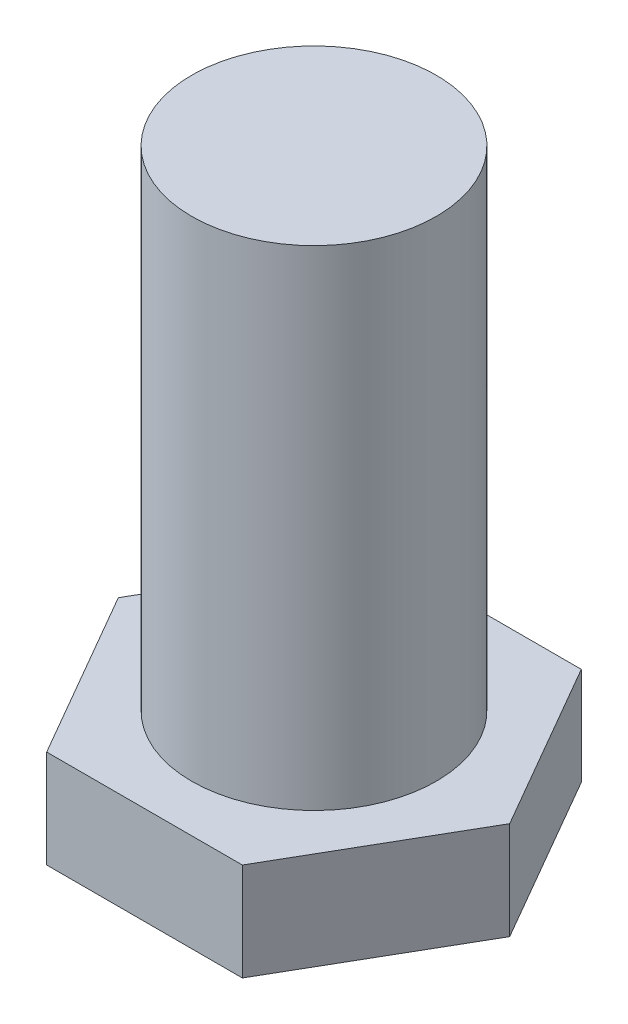
ISO-10303-21;
HEADER;
FILE_DESCRIPTION(('STEP AP214'),'2;1');
FILE_NAME('part.step','',(''),(''),'','','');
FILE_SCHEMA(('AUTOMOTIVE_DESIGN { 1 0 10303 214 1 1 1 1 }'));
ENDSEC;
DATA;
#1=APPLICATION_CONTEXT('core data for automotive mechanical design processes');
#2=APPLICATION_PROTOCOL_DEFINITION('international standard','automotive_design',2000,#1);
#3=PRODUCT_CONTEXT('',#1,'mechanical');
#4=PRODUCT('Part','Part','',(#3));
#5=PRODUCT_RELATED_PRODUCT_CATEGORY('part','',(#4));
#6=PRODUCT_DEFINITION_FORMATION('','',#4);
#7=PRODUCT_DEFINITION_CONTEXT('part definition',#1,'design');
#8=PRODUCT_DEFINITION('design','',#6,#7);
#9=PRODUCT_DEFINITION_SHAPE('','',#8);
#10=(LENGTH_UNIT() NAMED_UNIT(*) SI_UNIT(.MILLI.,.METRE.));
#11=(NAMED_UNIT(*) PLANE_ANGLE_UNIT() SI_UNIT($,.RADIAN.));
#12=(NAMED_UNIT(*) SI_UNIT($,.STERADIAN.) SOLID_ANGLE_UNIT());
#13=UNCERTAINTY_MEASURE_WITH_UNIT(LENGTH_MEASURE(1.E-05),#10,'distance_accuracy_value','');
#14=(GEOMETRIC_REPRESENTATION_CONTEXT(3) GLOBAL_UNCERTAINTY_ASSIGNED_CONTEXT((#13)) GLOBAL_UNIT_ASSIGNED_CONTEXT((#10,
#11,#12)) REPRESENTATION_CONTEXT('',''));
#15=CARTESIAN_POINT('',(0.,0.,0.));
#16=DIRECTION('',(0.,0.,1.));
#17=DIRECTION('',(1.,0.,0.));
#18=AXIS2_PLACEMENT_3D('',#15,#16,#17);
#19=CARTESIAN_POINT('',(2.,2.,3.46410161513775));
#20=DIRECTION('',(-0.866025403784439,0.,-0.499999999999999));
#21=DIRECTION('',(-0.499999999999999,0.,0.866025403784439));
#22=AXIS2_PLACEMENT_3D('',#19,#20,#21);
#23=PLANE('',#22);
#24=DIRECTION('',(0.5,0.,-0.866025403784439));
#25=VECTOR('',#24,1.);
#26=CARTESIAN_POINT('',(2.,0.,3.46410161513775));
#27=LINE('',#26,#25);
#28=CARTESIAN_POINT('',(2.,0.,3.46410161513775));
#29=VERTEX_POINT('',#28);
#30=CARTESIAN_POINT('',(4.,0.,0.));
#31=VERTEX_POINT('',#30);
#32=EDGE_CURVE('E134',#29,#31,#27,.T.);
#33=ORIENTED_EDGE('',*,*,#32,.T.);
#34=DIRECTION('',(0.,-1.,0.));
#35=VECTOR('',#34,1.);
#36=CARTESIAN_POINT('',(4.,2.,0.));
#37=LINE('',#36,#35);
#38=CARTESIAN_POINT('',(4.,2.,0.));
#39=VERTEX_POINT('',#38);
#40=EDGE_CURVE('E46',#39,#31,#37,.T.);
#41=ORIENTED_EDGE('',*,*,#40,.F.);
#42=DIRECTION('',(0.5,0.,-0.866025403784439));
#43=VECTOR('',#42,1.);
#44=CARTESIAN_POINT('',(2.,2.,3.46410161513775));
#45=LINE('',#44,#43);
#46=CARTESIAN_POINT('',(2.,2.,3.46410161513775));
#47=VERTEX_POINT('',#46);
#48=EDGE_CURVE('E151',#47,#39,#45,.T.);
#49=ORIENTED_EDGE('',*,*,#48,.F.);
#50=DIRECTION('',(0.,-1.,0.));
#51=VECTOR('',#50,1.);
#52=CARTESIAN_POINT('',(2.,2.,3.46410161513775));
#53=LINE('',#52,#51);
#54=EDGE_CURVE('E130',#47,#29,#53,.T.);
#55=ORIENTED_EDGE('',*,*,#54,.T.);
#56=EDGE_LOOP('',(#33,#41,#49,#55));
#57=FACE_BOUND('',#56,.T.);
#58=ADVANCED_FACE('F43',(#57),#23,.F.);
#59=CARTESIAN_POINT('',(4.,2.,0.));
#60=DIRECTION('',(-0.866025403784439,0.,0.5));
#61=DIRECTION('',(0.5,0.,0.866025403784439));
#62=AXIS2_PLACEMENT_3D('',#59,#60,#61);
#63=PLANE('',#62);
#64=DIRECTION('',(-0.5,0.,-0.866025403784439));
#65=VECTOR('',#64,1.);
#66=CARTESIAN_POINT('',(4.,0.,0.));
#67=LINE('',#66,#65);
#68=CARTESIAN_POINT('',(2.,0.,-3.46410161513775));
#69=VERTEX_POINT('',#68);
#70=EDGE_CURVE('E138',#31,#69,#67,.T.);
#71=ORIENTED_EDGE('',*,*,#70,.T.);
#72=DIRECTION('',(0.,-1.,0.));
#73=VECTOR('',#72,1.);
#74=CARTESIAN_POINT('',(2.,2.,-3.46410161513775));
#75=LINE('',#74,#73);
#76=CARTESIAN_POINT('',(2.,2.,-3.46410161513775));
#77=VERTEX_POINT('',#76);
#78=EDGE_CURVE('E157',#77,#69,#75,.T.);
#79=ORIENTED_EDGE('',*,*,#78,.F.);
#80=DIRECTION('',(-0.5,0.,-0.866025403784439));
#81=VECTOR('',#80,1.);
#82=CARTESIAN_POINT('',(4.,2.,0.));
#83=LINE('',#82,#81);
#84=EDGE_CURVE('E99',#39,#77,#83,.T.);
#85=ORIENTED_EDGE('',*,*,#84,.F.);
#86=ORIENTED_EDGE('',*,*,#40,.T.);
#87=EDGE_LOOP('',(#71,#79,#85,#86));
#88=FACE_BOUND('',#87,.T.);
#89=ADVANCED_FACE('F164',(#88),#63,.F.);
#90=CARTESIAN_POINT('',(2.,2.,-3.46410161513775));
#91=DIRECTION('',(0.,0.,1.));
#92=DIRECTION('',(1.,0.,0.));
#93=AXIS2_PLACEMENT_3D('',#90,#91,#92);
#94=PLANE('',#93);
#95=DIRECTION('',(-1.,0.,0.));
#96=VECTOR('',#95,1.);
#97=CARTESIAN_POINT('',(2.,0.,-3.46410161513775));
#98=LINE('',#97,#96);
#99=CARTESIAN_POINT('',(-2.,0.,-3.46410161513775));
#100=VERTEX_POINT('',#99);
#101=EDGE_CURVE('E142',#69,#100,#98,.T.);
#102=ORIENTED_EDGE('',*,*,#101,.T.);
#103=DIRECTION('',(0.,-1.,0.));
#104=VECTOR('',#103,1.);
#105=CARTESIAN_POINT('',(-2.,2.,-3.46410161513775));
#106=LINE('',#105,#104);
#107=CARTESIAN_POINT('',(-2.,2.,-3.46410161513775));
#108=VERTEX_POINT('',#107);
#109=EDGE_CURVE('E123',#108,#100,#106,.T.);
#110=ORIENTED_EDGE('',*,*,#109,.F.);
#111=DIRECTION('',(-1.,0.,0.));
#112=VECTOR('',#111,1.);
#113=CARTESIAN_POINT('',(2.,2.,-3.46410161513775));
#114=LINE('',#113,#112);
#115=EDGE_CURVE('E112',#77,#108,#114,.T.);
#116=ORIENTED_EDGE('',*,*,#115,.F.);
#117=ORIENTED_EDGE('',*,*,#78,.T.);
#118=EDGE_LOOP('',(#102,#110,#116,#117));
#119=FACE_BOUND('',#118,.T.);
#120=ADVANCED_FACE('F170',(#119),#94,.F.);
#121=CARTESIAN_POINT('',(-2.,2.,-3.46410161513775));
#122=DIRECTION('',(0.866025403784439,0.,0.5));
#123=DIRECTION('',(0.5,0.,-0.866025403784439));
#124=AXIS2_PLACEMENT_3D('',#121,#122,#123);
#125=PLANE('',#124);
#126=DIRECTION('',(-0.5,0.,0.866025403784439));
#127=VECTOR('',#126,1.);
#128=CARTESIAN_POINT('',(-2.,0.,-3.46410161513775));
#129=LINE('',#128,#127);
#130=CARTESIAN_POINT('',(-4.,0.,0.));
#131=VERTEX_POINT('',#130);
#132=EDGE_CURVE('E121',#100,#131,#129,.T.);
#133=ORIENTED_EDGE('',*,*,#132,.T.);
#134=DIRECTION('',(0.,-1.,0.));
#135=VECTOR('',#134,1.);
#136=CARTESIAN_POINT('',(-4.,2.,0.));
#137=LINE('',#136,#135);
#138=CARTESIAN_POINT('',(-4.,2.,0.));
#139=VERTEX_POINT('',#138);
#140=EDGE_CURVE('E118',#139,#131,#137,.T.);
#141=ORIENTED_EDGE('',*,*,#140,.F.);
#142=DIRECTION('',(-0.5,0.,0.866025403784439));
#143=VECTOR('',#142,1.);
#144=CARTESIAN_POINT('',(-2.,2.,-3.46410161513775));
#145=LINE('',#144,#143);
#146=EDGE_CURVE('E106',#108,#139,#145,.T.);
#147=ORIENTED_EDGE('',*,*,#146,.F.);
#148=ORIENTED_EDGE('',*,*,#109,.T.);
#149=EDGE_LOOP('',(#133,#141,#147,#148));
#150=FACE_BOUND('',#149,.T.);
#151=ADVANCED_FACE('F119',(#150),#125,.F.);
#152=CARTESIAN_POINT('',(-4.,2.,0.));
#153=DIRECTION('',(0.866025403784439,0.,-0.5));
#154=DIRECTION('',(-0.5,0.,-0.866025403784439));
#155=AXIS2_PLACEMENT_3D('',#152,#153,#154);
#156=PLANE('',#155);
#157=DIRECTION('',(0.5,0.,0.866025403784439));
#158=VECTOR('',#157,1.);
#159=CARTESIAN_POINT('',(-4.,0.,0.));
#160=LINE('',#159,#158);
#161=CARTESIAN_POINT('',(-2.,0.,3.46410161513775));
#162=VERTEX_POINT('',#161);
#163=EDGE_CURVE('E84',#131,#162,#160,.T.);
#164=ORIENTED_EDGE('',*,*,#163,.T.);
#165=DIRECTION('',(0.,-1.,0.));
#166=VECTOR('',#165,1.);
#167=CARTESIAN_POINT('',(-2.,2.,3.46410161513775));
#168=LINE('',#167,#166);
#169=CARTESIAN_POINT('',(-2.,2.,3.46410161513775));
#170=VERTEX_POINT('',#169);
#171=EDGE_CURVE('E124',#170,#162,#168,.T.);
#172=ORIENTED_EDGE('',*,*,#171,.F.);
#173=DIRECTION('',(0.5,0.,0.866025403784439));
#174=VECTOR('',#173,1.);
#175=CARTESIAN_POINT('',(-4.,2.,0.));
#176=LINE('',#175,#174);
#177=EDGE_CURVE('E110',#139,#170,#176,.T.);
#178=ORIENTED_EDGE('',*,*,#177,.F.);
#179=ORIENTED_EDGE('',*,*,#140,.T.);
#180=EDGE_LOOP('',(#164,#172,#178,#179));
#181=FACE_BOUND('',#180,.T.);
#182=ADVANCED_FACE('F126',(#181),#156,.F.);
#183=CARTESIAN_POINT('',(-2.,2.,3.46410161513775));
#184=DIRECTION('',(0.,0.,-1.));
#185=DIRECTION('',(-1.,0.,0.));
#186=AXIS2_PLACEMENT_3D('',#183,#184,#185);
#187=PLANE('',#186);
#188=DIRECTION('',(1.,0.,0.));
#189=VECTOR('',#188,1.);
#190=CARTESIAN_POINT('',(-2.,0.,3.46410161513775));
#191=LINE('',#190,#189);
#192=EDGE_CURVE('E90',#162,#29,#191,.T.);
#193=ORIENTED_EDGE('',*,*,#192,.T.);
#194=ORIENTED_EDGE('',*,*,#54,.F.);
#195=DIRECTION('',(1.,0.,0.));
#196=VECTOR('',#195,1.);
#197=CARTESIAN_POINT('',(-2.,2.,3.46410161513775));
#198=LINE('',#197,#196);
#199=EDGE_CURVE('E61',#170,#47,#198,.T.);
#200=ORIENTED_EDGE('',*,*,#199,.F.);
#201=ORIENTED_EDGE('',*,*,#171,.T.);
#202=EDGE_LOOP('',(#193,#194,#200,#201));
#203=FACE_BOUND('',#202,.T.);
#204=ADVANCED_FACE('F190',(#203),#187,.F.);
#205=CARTESIAN_POINT('',(0.,2.,0.));
#206=DIRECTION('',(0.,1.,0.));
#207=DIRECTION('',(0.,0.,1.));
#208=AXIS2_PLACEMENT_3D('',#205,#206,#207);
#209=PLANE('',#208);
#210=CARTESIAN_POINT('',(0.,2.,0.));
#211=DIRECTION('',(0.,1.,0.));
#212=DIRECTION('',(0.,0.,1.));
#213=AXIS2_PLACEMENT_3D('',#210,#211,#212);
#214=CIRCLE('',#213,2.5);
#215=CARTESIAN_POINT('',(0.,2.,2.5));
#216=VERTEX_POINT('',#215);
#217=EDGE_CURVE('E11',#216,#216,#214,.T.);
#218=ORIENTED_EDGE('',*,*,#217,.F.);
#219=EDGE_LOOP('',(#218));
#220=FACE_BOUND('',#219,.T.);
#221=ORIENTED_EDGE('',*,*,#48,.T.);
#222=ORIENTED_EDGE('',*,*,#84,.T.);
#223=ORIENTED_EDGE('',*,*,#115,.T.);
#224=ORIENTED_EDGE('',*,*,#146,.T.);
#225=ORIENTED_EDGE('',*,*,#177,.T.);
#226=ORIENTED_EDGE('',*,*,#199,.T.);
#227=EDGE_LOOP('',(#221,#222,#223,#224,#225,#226));
#228=FACE_BOUND('',#227,.T.);
#229=ADVANCED_FACE('F108',(#220,#228),#209,.T.);
#230=CARTESIAN_POINT('',(0.,0.,0.));
#231=DIRECTION('',(0.,1.,0.));
#232=DIRECTION('',(0.,0.,1.));
#233=AXIS2_PLACEMENT_3D('',#230,#231,#232);
#234=PLANE('',#233);
#235=ORIENTED_EDGE('',*,*,#32,.F.);
#236=ORIENTED_EDGE('',*,*,#192,.F.);
#237=ORIENTED_EDGE('',*,*,#163,.F.);
#238=ORIENTED_EDGE('',*,*,#132,.F.);
#239=ORIENTED_EDGE('',*,*,#101,.F.);
#240=ORIENTED_EDGE('',*,*,#70,.F.);
#241=EDGE_LOOP('',(#235,#236,#237,#238,#239,#240));
#242=FACE_BOUND('',#241,.T.);
#243=ADVANCED_FACE('F169',(#242),#234,.F.);
#244=CARTESIAN_POINT('',(0.,12.,0.));
#245=DIRECTION('',(0.,-1.,0.));
#246=DIRECTION('',(0.,0.,-1.));
#247=AXIS2_PLACEMENT_3D('',#244,#245,#246);
#248=CYLINDRICAL_SURFACE('',#247,2.5);
#249=CARTESIAN_POINT('',(0.,12.,0.));
#250=DIRECTION('',(0.,1.,0.));
#251=DIRECTION('',(0.,0.,1.));
#252=AXIS2_PLACEMENT_3D('',#249,#250,#251);
#253=CIRCLE('',#252,2.5);
#254=CARTESIAN_POINT('',(0.,12.,2.5));
#255=VERTEX_POINT('',#254);
#256=EDGE_CURVE('E139',#255,#255,#253,.T.);
#257=ORIENTED_EDGE('',*,*,#256,.F.);
#258=EDGE_LOOP('',(#257));
#259=FACE_BOUND('',#258,.T.);
#260=ORIENTED_EDGE('',*,*,#217,.T.);
#261=EDGE_LOOP('',(#260));
#262=FACE_BOUND('',#261,.T.);
#263=ADVANCED_FACE('F183',(#259,#262),#248,.T.);
#264=CARTESIAN_POINT('',(0.,12.,0.));
#265=DIRECTION('',(0.,1.,0.));
#266=DIRECTION('',(0.,0.,1.));
#267=AXIS2_PLACEMENT_3D('',#264,#265,#266);
#268=PLANE('',#267);
#269=ORIENTED_EDGE('',*,*,#256,.T.);
#270=EDGE_LOOP('',(#269));
#271=FACE_BOUND('',#270,.T.);
#272=ADVANCED_FACE('F181',(#271),#268,.T.);
#273=CLOSED_SHELL('',(#58,#89,#120,#151,#182,#204,#229,#243,#263,#272));
#274=MANIFOLD_SOLID_BREP('B2',#273);
#275=ADVANCED_BREP_SHAPE_REPRESENTATION('',(#18,#274),#14);
#276=SHAPE_DEFINITION_REPRESENTATION(#9,#275);
ENDSEC;
END-ISO-10303-21;
